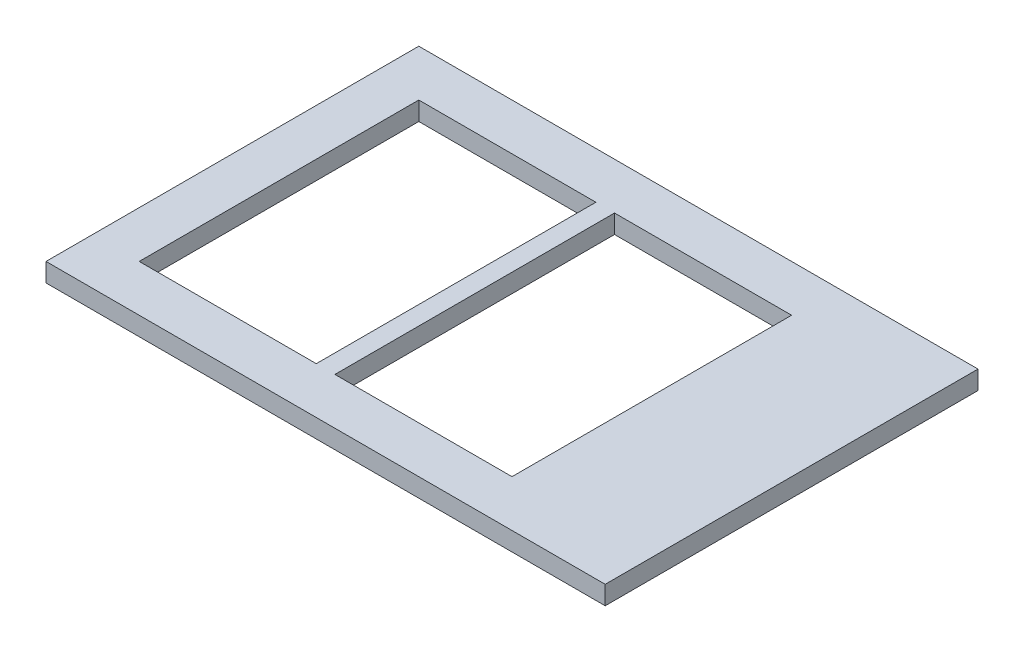
ISO-10303-21;
HEADER;
FILE_DESCRIPTION(('STEP AP214'),'2;1');
FILE_NAME('part.step','',(''),(''),'','','');
FILE_SCHEMA(('AUTOMOTIVE_DESIGN { 1 0 10303 214 1 1 1 1 }'));
ENDSEC;
DATA;
#1=APPLICATION_CONTEXT('core data for automotive mechanical design processes');
#2=APPLICATION_PROTOCOL_DEFINITION('international standard','automotive_design',2000,#1);
#3=PRODUCT_CONTEXT('',#1,'mechanical');
#4=PRODUCT('Part','Part','',(#3));
#5=PRODUCT_RELATED_PRODUCT_CATEGORY('part','',(#4));
#6=PRODUCT_DEFINITION_FORMATION('','',#4);
#7=PRODUCT_DEFINITION_CONTEXT('part definition',#1,'design');
#8=PRODUCT_DEFINITION('design','',#6,#7);
#9=PRODUCT_DEFINITION_SHAPE('','',#8);
#10=(LENGTH_UNIT() NAMED_UNIT(*) SI_UNIT(.MILLI.,.METRE.));
#11=(NAMED_UNIT(*) PLANE_ANGLE_UNIT() SI_UNIT($,.RADIAN.));
#12=(NAMED_UNIT(*) SI_UNIT($,.STERADIAN.) SOLID_ANGLE_UNIT());
#13=UNCERTAINTY_MEASURE_WITH_UNIT(LENGTH_MEASURE(1.E-05),#10,'distance_accuracy_value','');
#14=(GEOMETRIC_REPRESENTATION_CONTEXT(3) GLOBAL_UNCERTAINTY_ASSIGNED_CONTEXT((#13)) GLOBAL_UNIT_ASSIGNED_CONTEXT((#10,
#11,#12)) REPRESENTATION_CONTEXT('',''));
#15=CARTESIAN_POINT('',(0.,0.,0.));
#16=DIRECTION('',(0.,0.,1.));
#17=DIRECTION('',(1.,0.,0.));
#18=AXIS2_PLACEMENT_3D('',#15,#16,#17);
#19=CARTESIAN_POINT('',(0.,20.,200.));
#20=DIRECTION('',(0.,0.,-1.));
#21=DIRECTION('',(-1.,0.,0.));
#22=AXIS2_PLACEMENT_3D('',#19,#20,#21);
#23=PLANE('',#22);
#24=DIRECTION('',(1.,0.,0.));
#25=VECTOR('',#24,1.);
#26=CARTESIAN_POINT('',(0.,0.,200.));
#27=LINE('',#26,#25);
#28=CARTESIAN_POINT('',(-300.,0.,200.));
#29=VERTEX_POINT('',#28);
#30=CARTESIAN_POINT('',(300.,0.,200.));
#31=VERTEX_POINT('',#30);
#32=EDGE_CURVE('E237',#29,#31,#27,.T.);
#33=ORIENTED_EDGE('',*,*,#32,.T.);
#34=DIRECTION('',(0.,-1.,0.));
#35=VECTOR('',#34,1.);
#36=CARTESIAN_POINT('',(300.,20.,200.));
#37=LINE('',#36,#35);
#38=CARTESIAN_POINT('',(300.,20.,200.));
#39=VERTEX_POINT('',#38);
#40=EDGE_CURVE('E11',#39,#31,#37,.T.);
#41=ORIENTED_EDGE('',*,*,#40,.F.);
#42=DIRECTION('',(1.,0.,0.));
#43=VECTOR('',#42,1.);
#44=CARTESIAN_POINT('',(0.,20.,200.));
#45=LINE('',#44,#43);
#46=CARTESIAN_POINT('',(-300.,20.,200.));
#47=VERTEX_POINT('',#46);
#48=EDGE_CURVE('E245',#47,#39,#45,.T.);
#49=ORIENTED_EDGE('',*,*,#48,.F.);
#50=DIRECTION('',(0.,-1.,0.));
#51=VECTOR('',#50,1.);
#52=CARTESIAN_POINT('',(-300.,20.,200.));
#53=LINE('',#52,#51);
#54=EDGE_CURVE('E68',#47,#29,#53,.T.);
#55=ORIENTED_EDGE('',*,*,#54,.T.);
#56=EDGE_LOOP('',(#33,#41,#49,#55));
#57=FACE_BOUND('',#56,.T.);
#58=ADVANCED_FACE('F51',(#57),#23,.F.);
#59=CARTESIAN_POINT('',(300.,20.,0.));
#60=DIRECTION('',(-1.,0.,0.));
#61=DIRECTION('',(0.,0.,1.));
#62=AXIS2_PLACEMENT_3D('',#59,#60,#61);
#63=PLANE('',#62);
#64=DIRECTION('',(0.,0.,-1.));
#65=VECTOR('',#64,1.);
#66=CARTESIAN_POINT('',(300.,0.,0.));
#67=LINE('',#66,#65);
#68=CARTESIAN_POINT('',(300.,0.,-200.));
#69=VERTEX_POINT('',#68);
#70=EDGE_CURVE('E260',#31,#69,#67,.T.);
#71=ORIENTED_EDGE('',*,*,#70,.T.);
#72=DIRECTION('',(0.,-1.,0.));
#73=VECTOR('',#72,1.);
#74=CARTESIAN_POINT('',(300.,20.,-200.));
#75=LINE('',#74,#73);
#76=CARTESIAN_POINT('',(300.,20.,-200.));
#77=VERTEX_POINT('',#76);
#78=EDGE_CURVE('E60',#77,#69,#75,.T.);
#79=ORIENTED_EDGE('',*,*,#78,.F.);
#80=DIRECTION('',(0.,0.,-1.));
#81=VECTOR('',#80,1.);
#82=CARTESIAN_POINT('',(300.,20.,0.));
#83=LINE('',#82,#81);
#84=EDGE_CURVE('E94',#39,#77,#83,.T.);
#85=ORIENTED_EDGE('',*,*,#84,.F.);
#86=ORIENTED_EDGE('',*,*,#40,.T.);
#87=EDGE_LOOP('',(#71,#79,#85,#86));
#88=FACE_BOUND('',#87,.T.);
#89=ADVANCED_FACE('F278',(#88),#63,.F.);
#90=CARTESIAN_POINT('',(0.,20.,-200.));
#91=DIRECTION('',(0.,0.,-1.));
#92=DIRECTION('',(-1.,0.,0.));
#93=AXIS2_PLACEMENT_3D('',#90,#91,#92);
#94=PLANE('',#93);
#95=DIRECTION('',(1.,0.,0.));
#96=VECTOR('',#95,1.);
#97=CARTESIAN_POINT('',(0.,0.,-200.));
#98=LINE('',#97,#96);
#99=CARTESIAN_POINT('',(-300.,0.,-200.));
#100=VERTEX_POINT('',#99);
#101=EDGE_CURVE('E264',#100,#69,#98,.T.);
#102=ORIENTED_EDGE('',*,*,#101,.F.);
#103=DIRECTION('',(0.,-1.,0.));
#104=VECTOR('',#103,1.);
#105=CARTESIAN_POINT('',(-300.,20.,-200.));
#106=LINE('',#105,#104);
#107=CARTESIAN_POINT('',(-300.,20.,-200.));
#108=VERTEX_POINT('',#107);
#109=EDGE_CURVE('E83',#108,#100,#106,.T.);
#110=ORIENTED_EDGE('',*,*,#109,.F.);
#111=DIRECTION('',(1.,0.,0.));
#112=VECTOR('',#111,1.);
#113=CARTESIAN_POINT('',(0.,20.,-200.));
#114=LINE('',#113,#112);
#115=EDGE_CURVE('E251',#108,#77,#114,.T.);
#116=ORIENTED_EDGE('',*,*,#115,.T.);
#117=ORIENTED_EDGE('',*,*,#78,.T.);
#118=EDGE_LOOP('',(#102,#110,#116,#117));
#119=FACE_BOUND('',#118,.T.);
#120=ADVANCED_FACE('F276',(#119),#94,.T.);
#121=CARTESIAN_POINT('',(-300.,20.,0.));
#122=DIRECTION('',(-1.,0.,0.));
#123=DIRECTION('',(0.,0.,1.));
#124=AXIS2_PLACEMENT_3D('',#121,#122,#123);
#125=PLANE('',#124);
#126=DIRECTION('',(0.,0.,-1.));
#127=VECTOR('',#126,1.);
#128=CARTESIAN_POINT('',(-300.,0.,0.));
#129=LINE('',#128,#127);
#130=EDGE_CURVE('E248',#29,#100,#129,.T.);
#131=ORIENTED_EDGE('',*,*,#130,.F.);
#132=ORIENTED_EDGE('',*,*,#54,.F.);
#133=DIRECTION('',(0.,0.,-1.));
#134=VECTOR('',#133,1.);
#135=CARTESIAN_POINT('',(-300.,20.,0.));
#136=LINE('',#135,#134);
#137=EDGE_CURVE('E255',#47,#108,#136,.T.);
#138=ORIENTED_EDGE('',*,*,#137,.T.);
#139=ORIENTED_EDGE('',*,*,#109,.T.);
#140=EDGE_LOOP('',(#131,#132,#138,#139));
#141=FACE_BOUND('',#140,.T.);
#142=ADVANCED_FACE('F283',(#141),#125,.T.);
#143=CARTESIAN_POINT('',(0.,20.,0.));
#144=DIRECTION('',(0.,1.,0.));
#145=DIRECTION('',(0.,0.,1.));
#146=AXIS2_PLACEMENT_3D('',#143,#144,#145);
#147=PLANE('',#146);
#148=ORIENTED_EDGE('',*,*,#48,.T.);
#149=ORIENTED_EDGE('',*,*,#84,.T.);
#150=ORIENTED_EDGE('',*,*,#115,.F.);
#151=ORIENTED_EDGE('',*,*,#137,.F.);
#152=EDGE_LOOP('',(#148,#149,#150,#151));
#153=FACE_BOUND('',#152,.T.);
#154=DIRECTION('',(1.,0.,0.));
#155=VECTOR('',#154,1.);
#156=CARTESIAN_POINT('',(0.,20.,150.));
#157=LINE('',#156,#155);
#158=CARTESIAN_POINT('',(-40.,20.,150.));
#159=VERTEX_POINT('',#158);
#160=CARTESIAN_POINT('',(150.,20.,150.));
#161=VERTEX_POINT('',#160);
#162=EDGE_CURVE('E150',#159,#161,#157,.T.);
#163=ORIENTED_EDGE('',*,*,#162,.F.);
#164=DIRECTION('',(0.,0.,-1.));
#165=VECTOR('',#164,1.);
#166=CARTESIAN_POINT('',(-40.,20.,0.));
#167=LINE('',#166,#165);
#168=CARTESIAN_POINT('',(-40.,20.,-150.));
#169=VERTEX_POINT('',#168);
#170=EDGE_CURVE('E161',#159,#169,#167,.T.);
#171=ORIENTED_EDGE('',*,*,#170,.T.);
#172=DIRECTION('',(1.,0.,0.));
#173=VECTOR('',#172,1.);
#174=CARTESIAN_POINT('',(0.,20.,-150.));
#175=LINE('',#174,#173);
#176=CARTESIAN_POINT('',(150.,20.,-150.));
#177=VERTEX_POINT('',#176);
#178=EDGE_CURVE('E167',#169,#177,#175,.T.);
#179=ORIENTED_EDGE('',*,*,#178,.T.);
#180=DIRECTION('',(0.,0.,-1.));
#181=VECTOR('',#180,1.);
#182=CARTESIAN_POINT('',(150.,20.,0.));
#183=LINE('',#182,#181);
#184=EDGE_CURVE('E172',#161,#177,#183,.T.);
#185=ORIENTED_EDGE('',*,*,#184,.F.);
#186=EDGE_LOOP('',(#163,#171,#179,#185));
#187=FACE_BOUND('',#186,.T.);
#188=DIRECTION('',(0.,0.,-1.));
#189=VECTOR('',#188,1.);
#190=CARTESIAN_POINT('',(-60.,20.,0.));
#191=LINE('',#190,#189);
#192=CARTESIAN_POINT('',(-60.,20.,150.));
#193=VERTEX_POINT('',#192);
#194=CARTESIAN_POINT('',(-60.,20.,-150.));
#195=VERTEX_POINT('',#194);
#196=EDGE_CURVE('E185',#193,#195,#191,.T.);
#197=ORIENTED_EDGE('',*,*,#196,.F.);
#198=DIRECTION('',(1.,0.,0.));
#199=VECTOR('',#198,1.);
#200=CARTESIAN_POINT('',(0.,20.,150.));
#201=LINE('',#200,#199);
#202=CARTESIAN_POINT('',(-250.,20.,150.));
#203=VERTEX_POINT('',#202);
#204=EDGE_CURVE('E189',#203,#193,#201,.T.);
#205=ORIENTED_EDGE('',*,*,#204,.F.);
#206=DIRECTION('',(0.,0.,-1.));
#207=VECTOR('',#206,1.);
#208=CARTESIAN_POINT('',(-250.,20.,0.));
#209=LINE('',#208,#207);
#210=CARTESIAN_POINT('',(-250.,20.,-150.));
#211=VERTEX_POINT('',#210);
#212=EDGE_CURVE('E193',#203,#211,#209,.T.);
#213=ORIENTED_EDGE('',*,*,#212,.T.);
#214=DIRECTION('',(1.,0.,0.));
#215=VECTOR('',#214,1.);
#216=CARTESIAN_POINT('',(0.,20.,-150.));
#217=LINE('',#216,#215);
#218=EDGE_CURVE('E197',#211,#195,#217,.T.);
#219=ORIENTED_EDGE('',*,*,#218,.T.);
#220=EDGE_LOOP('',(#197,#205,#213,#219));
#221=FACE_BOUND('',#220,.T.);
#222=ADVANCED_FACE('F169',(#153,#187,#221),#147,.T.);
#223=CARTESIAN_POINT('',(0.,0.,0.));
#224=DIRECTION('',(0.,1.,0.));
#225=DIRECTION('',(0.,0.,1.));
#226=AXIS2_PLACEMENT_3D('',#223,#224,#225);
#227=PLANE('',#226);
#228=ORIENTED_EDGE('',*,*,#32,.F.);
#229=ORIENTED_EDGE('',*,*,#130,.T.);
#230=ORIENTED_EDGE('',*,*,#101,.T.);
#231=ORIENTED_EDGE('',*,*,#70,.F.);
#232=EDGE_LOOP('',(#228,#229,#230,#231));
#233=FACE_BOUND('',#232,.T.);
#234=DIRECTION('',(1.,0.,0.));
#235=VECTOR('',#234,1.);
#236=CARTESIAN_POINT('',(0.,0.,150.));
#237=LINE('',#236,#235);
#238=CARTESIAN_POINT('',(-40.,0.,150.));
#239=VERTEX_POINT('',#238);
#240=CARTESIAN_POINT('',(150.,0.,150.));
#241=VERTEX_POINT('',#240);
#242=EDGE_CURVE('E153',#239,#241,#237,.T.);
#243=ORIENTED_EDGE('',*,*,#242,.T.);
#244=DIRECTION('',(0.,0.,-1.));
#245=VECTOR('',#244,1.);
#246=CARTESIAN_POINT('',(150.,0.,0.));
#247=LINE('',#246,#245);
#248=CARTESIAN_POINT('',(150.,0.,-150.));
#249=VERTEX_POINT('',#248);
#250=EDGE_CURVE('E210',#241,#249,#247,.T.);
#251=ORIENTED_EDGE('',*,*,#250,.T.);
#252=DIRECTION('',(1.,0.,0.));
#253=VECTOR('',#252,1.);
#254=CARTESIAN_POINT('',(0.,0.,-150.));
#255=LINE('',#254,#253);
#256=CARTESIAN_POINT('',(-40.,0.,-150.));
#257=VERTEX_POINT('',#256);
#258=EDGE_CURVE('E206',#257,#249,#255,.T.);
#259=ORIENTED_EDGE('',*,*,#258,.F.);
#260=DIRECTION('',(0.,0.,-1.));
#261=VECTOR('',#260,1.);
#262=CARTESIAN_POINT('',(-40.,0.,0.));
#263=LINE('',#262,#261);
#264=EDGE_CURVE('E203',#239,#257,#263,.T.);
#265=ORIENTED_EDGE('',*,*,#264,.F.);
#266=EDGE_LOOP('',(#243,#251,#259,#265));
#267=FACE_BOUND('',#266,.T.);
#268=DIRECTION('',(0.,0.,-1.));
#269=VECTOR('',#268,1.);
#270=CARTESIAN_POINT('',(-60.,0.,0.));
#271=LINE('',#270,#269);
#272=CARTESIAN_POINT('',(-60.,0.,150.));
#273=VERTEX_POINT('',#272);
#274=CARTESIAN_POINT('',(-60.,0.,-150.));
#275=VERTEX_POINT('',#274);
#276=EDGE_CURVE('E214',#273,#275,#271,.T.);
#277=ORIENTED_EDGE('',*,*,#276,.T.);
#278=DIRECTION('',(1.,0.,0.));
#279=VECTOR('',#278,1.);
#280=CARTESIAN_POINT('',(0.,0.,-150.));
#281=LINE('',#280,#279);
#282=CARTESIAN_POINT('',(-250.,0.,-150.));
#283=VERTEX_POINT('',#282);
#284=EDGE_CURVE('E174',#283,#275,#281,.T.);
#285=ORIENTED_EDGE('',*,*,#284,.F.);
#286=DIRECTION('',(0.,0.,-1.));
#287=VECTOR('',#286,1.);
#288=CARTESIAN_POINT('',(-250.,0.,0.));
#289=LINE('',#288,#287);
#290=CARTESIAN_POINT('',(-250.,0.,150.));
#291=VERTEX_POINT('',#290);
#292=EDGE_CURVE('E178',#291,#283,#289,.T.);
#293=ORIENTED_EDGE('',*,*,#292,.F.);
#294=DIRECTION('',(1.,0.,0.));
#295=VECTOR('',#294,1.);
#296=CARTESIAN_POINT('',(0.,0.,150.));
#297=LINE('',#296,#295);
#298=EDGE_CURVE('E218',#291,#273,#297,.T.);
#299=ORIENTED_EDGE('',*,*,#298,.T.);
#300=EDGE_LOOP('',(#277,#285,#293,#299));
#301=FACE_BOUND('',#300,.T.);
#302=ADVANCED_FACE('F281',(#233,#267,#301),#227,.F.);
#303=CARTESIAN_POINT('',(-60.,20.,0.));
#304=DIRECTION('',(-1.,0.,0.));
#305=DIRECTION('',(0.,0.,1.));
#306=AXIS2_PLACEMENT_3D('',#303,#304,#305);
#307=PLANE('',#306);
#308=ORIENTED_EDGE('',*,*,#276,.F.);
#309=DIRECTION('',(0.,-1.,0.));
#310=VECTOR('',#309,1.);
#311=CARTESIAN_POINT('',(-60.,20.,150.));
#312=LINE('',#311,#310);
#313=EDGE_CURVE('E234',#193,#273,#312,.T.);
#314=ORIENTED_EDGE('',*,*,#313,.F.);
#315=ORIENTED_EDGE('',*,*,#196,.T.);
#316=DIRECTION('',(0.,-1.,0.));
#317=VECTOR('',#316,1.);
#318=CARTESIAN_POINT('',(-60.,20.,-150.));
#319=LINE('',#318,#317);
#320=EDGE_CURVE('E157',#195,#275,#319,.T.);
#321=ORIENTED_EDGE('',*,*,#320,.T.);
#322=EDGE_LOOP('',(#308,#314,#315,#321));
#323=FACE_BOUND('',#322,.T.);
#324=ADVANCED_FACE('F323',(#323),#307,.T.);
#325=CARTESIAN_POINT('',(0.,20.,150.));
#326=DIRECTION('',(0.,0.,-1.));
#327=DIRECTION('',(-1.,0.,0.));
#328=AXIS2_PLACEMENT_3D('',#325,#326,#327);
#329=PLANE('',#328);
#330=ORIENTED_EDGE('',*,*,#298,.F.);
#331=DIRECTION('',(0.,-1.,0.));
#332=VECTOR('',#331,1.);
#333=CARTESIAN_POINT('',(-250.,20.,150.));
#334=LINE('',#333,#332);
#335=EDGE_CURVE('E231',#203,#291,#334,.T.);
#336=ORIENTED_EDGE('',*,*,#335,.F.);
#337=ORIENTED_EDGE('',*,*,#204,.T.);
#338=ORIENTED_EDGE('',*,*,#313,.T.);
#339=EDGE_LOOP('',(#330,#336,#337,#338));
#340=FACE_BOUND('',#339,.T.);
#341=ADVANCED_FACE('F334',(#340),#329,.T.);
#342=CARTESIAN_POINT('',(-250.,20.,0.));
#343=DIRECTION('',(-1.,0.,0.));
#344=DIRECTION('',(0.,0.,1.));
#345=AXIS2_PLACEMENT_3D('',#342,#343,#344);
#346=PLANE('',#345);
#347=ORIENTED_EDGE('',*,*,#292,.T.);
#348=DIRECTION('',(0.,-1.,0.));
#349=VECTOR('',#348,1.);
#350=CARTESIAN_POINT('',(-250.,20.,-150.));
#351=LINE('',#350,#349);
#352=EDGE_CURVE('E227',#211,#283,#351,.T.);
#353=ORIENTED_EDGE('',*,*,#352,.F.);
#354=ORIENTED_EDGE('',*,*,#212,.F.);
#355=ORIENTED_EDGE('',*,*,#335,.T.);
#356=EDGE_LOOP('',(#347,#353,#354,#355));
#357=FACE_BOUND('',#356,.T.);
#358=ADVANCED_FACE('F343',(#357),#346,.F.);
#359=CARTESIAN_POINT('',(0.,20.,150.));
#360=DIRECTION('',(0.,0.,-1.));
#361=DIRECTION('',(-1.,0.,0.));
#362=AXIS2_PLACEMENT_3D('',#359,#360,#361);
#363=PLANE('',#362);
#364=ORIENTED_EDGE('',*,*,#242,.F.);
#365=DIRECTION('',(0.,-1.,0.));
#366=VECTOR('',#365,1.);
#367=CARTESIAN_POINT('',(-40.,20.,150.));
#368=LINE('',#367,#366);
#369=EDGE_CURVE('E146',#159,#239,#368,.T.);
#370=ORIENTED_EDGE('',*,*,#369,.F.);
#371=ORIENTED_EDGE('',*,*,#162,.T.);
#372=DIRECTION('',(0.,-1.,0.));
#373=VECTOR('',#372,1.);
#374=CARTESIAN_POINT('',(150.,20.,150.));
#375=LINE('',#374,#373);
#376=EDGE_CURVE('E200',#161,#241,#375,.T.);
#377=ORIENTED_EDGE('',*,*,#376,.T.);
#378=EDGE_LOOP('',(#364,#370,#371,#377));
#379=FACE_BOUND('',#378,.T.);
#380=ADVANCED_FACE('F148',(#379),#363,.T.);
#381=CARTESIAN_POINT('',(-40.,20.,0.));
#382=DIRECTION('',(-1.,0.,0.));
#383=DIRECTION('',(0.,0.,1.));
#384=AXIS2_PLACEMENT_3D('',#381,#382,#383);
#385=PLANE('',#384);
#386=ORIENTED_EDGE('',*,*,#264,.T.);
#387=DIRECTION('',(0.,-1.,0.));
#388=VECTOR('',#387,1.);
#389=CARTESIAN_POINT('',(-40.,20.,-150.));
#390=LINE('',#389,#388);
#391=EDGE_CURVE('E158',#169,#257,#390,.T.);
#392=ORIENTED_EDGE('',*,*,#391,.F.);
#393=ORIENTED_EDGE('',*,*,#170,.F.);
#394=ORIENTED_EDGE('',*,*,#369,.T.);
#395=EDGE_LOOP('',(#386,#392,#393,#394));
#396=FACE_BOUND('',#395,.T.);
#397=ADVANCED_FACE('F162',(#396),#385,.F.);
#398=CARTESIAN_POINT('',(0.,20.,-150.));
#399=DIRECTION('',(0.,0.,-1.));
#400=DIRECTION('',(-1.,0.,0.));
#401=AXIS2_PLACEMENT_3D('',#398,#399,#400);
#402=PLANE('',#401);
#403=ORIENTED_EDGE('',*,*,#258,.T.);
#404=DIRECTION('',(0.,-1.,0.));
#405=VECTOR('',#404,1.);
#406=CARTESIAN_POINT('',(150.,20.,-150.));
#407=LINE('',#406,#405);
#408=EDGE_CURVE('E240',#177,#249,#407,.T.);
#409=ORIENTED_EDGE('',*,*,#408,.F.);
#410=ORIENTED_EDGE('',*,*,#178,.F.);
#411=ORIENTED_EDGE('',*,*,#391,.T.);
#412=EDGE_LOOP('',(#403,#409,#410,#411));
#413=FACE_BOUND('',#412,.T.);
#414=ADVANCED_FACE('F367',(#413),#402,.F.);
#415=CARTESIAN_POINT('',(150.,20.,0.));
#416=DIRECTION('',(-1.,0.,0.));
#417=DIRECTION('',(0.,0.,1.));
#418=AXIS2_PLACEMENT_3D('',#415,#416,#417);
#419=PLANE('',#418);
#420=ORIENTED_EDGE('',*,*,#250,.F.);
#421=ORIENTED_EDGE('',*,*,#376,.F.);
#422=ORIENTED_EDGE('',*,*,#184,.T.);
#423=ORIENTED_EDGE('',*,*,#408,.T.);
#424=EDGE_LOOP('',(#420,#421,#422,#423));
#425=FACE_BOUND('',#424,.T.);
#426=ADVANCED_FACE('F375',(#425),#419,.T.);
#427=CARTESIAN_POINT('',(0.,20.,-150.));
#428=DIRECTION('',(0.,0.,-1.));
#429=DIRECTION('',(-1.,0.,0.));
#430=AXIS2_PLACEMENT_3D('',#427,#428,#429);
#431=PLANE('',#430);
#432=ORIENTED_EDGE('',*,*,#284,.T.);
#433=ORIENTED_EDGE('',*,*,#320,.F.);
#434=ORIENTED_EDGE('',*,*,#218,.F.);
#435=ORIENTED_EDGE('',*,*,#352,.T.);
#436=EDGE_LOOP('',(#432,#433,#434,#435));
#437=FACE_BOUND('',#436,.T.);
#438=ADVANCED_FACE('F384',(#437),#431,.F.);
#439=CLOSED_SHELL('',(#58,#89,#120,#142,#222,#302,#324,#341,#358,#380,#397,#414,#426,#438));
#440=MANIFOLD_SOLID_BREP('B2',#439);
#441=ADVANCED_BREP_SHAPE_REPRESENTATION('',(#18,#440),#14);
#442=SHAPE_DEFINITION_REPRESENTATION(#9,#441);
ENDSEC;
END-ISO-10303-21;
